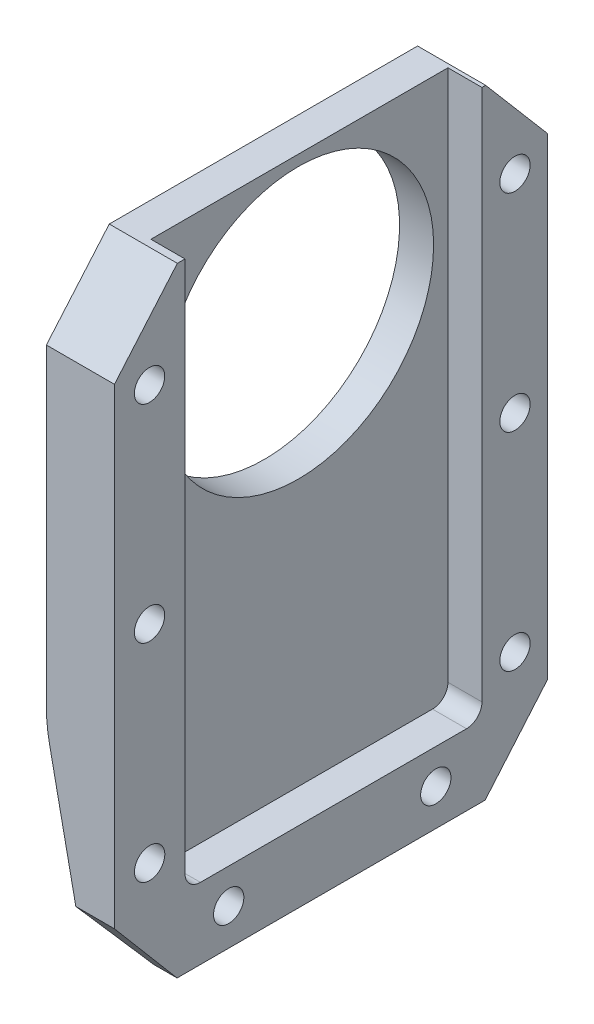
ISO-10303-21;
HEADER;
FILE_DESCRIPTION(('STEP AP214'),'2;1');
FILE_NAME('part.step','',(''),(''),'','','');
FILE_SCHEMA(('AUTOMOTIVE_DESIGN { 1 0 10303 214 1 1 1 1 }'));
ENDSEC;
DATA;
#1=APPLICATION_CONTEXT('core data for automotive mechanical design processes');
#2=APPLICATION_PROTOCOL_DEFINITION('international standard','automotive_design',2000,#1);
#3=PRODUCT_CONTEXT('',#1,'mechanical');
#4=PRODUCT('Part','Part','',(#3));
#5=PRODUCT_RELATED_PRODUCT_CATEGORY('part','',(#4));
#6=PRODUCT_DEFINITION_FORMATION('','',#4);
#7=PRODUCT_DEFINITION_CONTEXT('part definition',#1,'design');
#8=PRODUCT_DEFINITION('design','',#6,#7);
#9=PRODUCT_DEFINITION_SHAPE('','',#8);
#10=(LENGTH_UNIT() NAMED_UNIT(*) SI_UNIT(.MILLI.,.METRE.));
#11=(NAMED_UNIT(*) PLANE_ANGLE_UNIT() SI_UNIT($,.RADIAN.));
#12=(NAMED_UNIT(*) SI_UNIT($,.STERADIAN.) SOLID_ANGLE_UNIT());
#13=UNCERTAINTY_MEASURE_WITH_UNIT(LENGTH_MEASURE(1.E-05),#10,'distance_accuracy_value','');
#14=(GEOMETRIC_REPRESENTATION_CONTEXT(3) GLOBAL_UNCERTAINTY_ASSIGNED_CONTEXT((#13)) GLOBAL_UNIT_ASSIGNED_CONTEXT((#10,
#11,#12)) REPRESENTATION_CONTEXT('',''));
#15=CARTESIAN_POINT('',(0.,0.,0.));
#16=DIRECTION('',(0.,0.,1.));
#17=DIRECTION('',(1.,0.,0.));
#18=AXIS2_PLACEMENT_3D('',#15,#16,#17);
#19=CARTESIAN_POINT('',(-1.91664376205864,0.,35.56));
#20=DIRECTION('',(0.,1.,0.));
#21=DIRECTION('',(0.,0.,1.));
#22=AXIS2_PLACEMENT_3D('',#19,#20,#21);
#23=PLANE('',#22);
#24=DIRECTION('',(0.,0.,-1.));
#25=VECTOR('',#24,1.);
#26=CARTESIAN_POINT('',(-1.91664376205864,0.,35.56));
#27=LINE('',#26,#25);
#28=CARTESIAN_POINT('',(-1.91664376205864,0.,30.4170918583045));
#29=VERTEX_POINT('',#28);
#30=CARTESIAN_POINT('',(-1.91664376205864,0.,5.12869281639009));
#31=VERTEX_POINT('',#30);
#32=EDGE_CURVE('E189',#29,#31,#27,.T.);
#33=ORIENTED_EDGE('',*,*,#32,.T.);
#34=DIRECTION('',(1.,0.,0.));
#35=VECTOR('',#34,1.);
#36=CARTESIAN_POINT('',(-5.588,0.,5.12869281639009));
#37=LINE('',#36,#35);
#38=CARTESIAN_POINT('',(0.,0.,5.12869281639009));
#39=VERTEX_POINT('',#38);
#40=EDGE_CURVE('E248',#31,#39,#37,.T.);
#41=ORIENTED_EDGE('',*,*,#40,.T.);
#42=DIRECTION('',(0.,0.,-1.));
#43=VECTOR('',#42,1.);
#44=CARTESIAN_POINT('',(0.,0.,35.56));
#45=LINE('',#44,#43);
#46=CARTESIAN_POINT('',(0.,0.,30.4170918583045));
#47=VERTEX_POINT('',#46);
#48=EDGE_CURVE('E197',#47,#39,#45,.T.);
#49=ORIENTED_EDGE('',*,*,#48,.F.);
#50=DIRECTION('',(1.,0.,0.));
#51=VECTOR('',#50,1.);
#52=CARTESIAN_POINT('',(-5.588,0.,30.4170918583045));
#53=LINE('',#52,#51);
#54=EDGE_CURVE('E229',#29,#47,#53,.T.);
#55=ORIENTED_EDGE('',*,*,#54,.F.);
#56=EDGE_LOOP('',(#33,#41,#49,#55));
#57=FACE_BOUND('',#56,.T.);
#58=ADVANCED_FACE('F43',(#57),#23,.F.);
#59=CARTESIAN_POINT('',(0.,0.,35.56));
#60=DIRECTION('',(-1.,0.,0.));
#61=DIRECTION('',(0.,0.,1.));
#62=AXIS2_PLACEMENT_3D('',#59,#60,#61);
#63=PLANE('',#62);
#64=CARTESIAN_POINT('',(0.,43.3095233691544,2.67853591924794));
#65=DIRECTION('',(-1.,0.,0.));
#66=DIRECTION('',(0.,0.,1.));
#67=AXIS2_PLACEMENT_3D('',#64,#65,#66);
#68=CIRCLE('',#67,1.24459999999998);
#69=CARTESIAN_POINT('',(0.,43.3095233691544,3.92313591924793));
#70=VERTEX_POINT('',#69);
#71=EDGE_CURVE('E568',#70,#70,#68,.T.);
#72=ORIENTED_EDGE('',*,*,#71,.T.);
#73=EDGE_LOOP('',(#72));
#74=FACE_BOUND('',#73,.T.);
#75=CARTESIAN_POINT('',(0.,26.3095233691544,2.67853591924794));
#76=DIRECTION('',(-1.,0.,0.));
#77=DIRECTION('',(0.,0.,1.));
#78=AXIS2_PLACEMENT_3D('',#75,#76,#77);
#79=CIRCLE('',#78,1.24459999999999);
#80=CARTESIAN_POINT('',(0.,26.3095233691544,3.92313591924793));
#81=VERTEX_POINT('',#80);
#82=EDGE_CURVE('E579',#81,#81,#79,.T.);
#83=ORIENTED_EDGE('',*,*,#82,.T.);
#84=EDGE_LOOP('',(#83));
#85=FACE_BOUND('',#84,.T.);
#86=CARTESIAN_POINT('',(0.,9.30952336915439,2.67853591924794));
#87=DIRECTION('',(-1.,0.,0.));
#88=DIRECTION('',(0.,0.,1.));
#89=AXIS2_PLACEMENT_3D('',#86,#87,#88);
#90=CIRCLE('',#89,1.24459999999999);
#91=CARTESIAN_POINT('',(0.,9.30952336915439,3.92313591924793));
#92=VERTEX_POINT('',#91);
#93=EDGE_CURVE('E582',#92,#92,#90,.T.);
#94=ORIENTED_EDGE('',*,*,#93,.T.);
#95=EDGE_LOOP('',(#94));
#96=FACE_BOUND('',#95,.T.);
#97=CARTESIAN_POINT('',(0.,3.00952336915439,9.17853591924794));
#98=DIRECTION('',(-1.,0.,0.));
#99=DIRECTION('',(0.,0.,1.));
#100=AXIS2_PLACEMENT_3D('',#97,#98,#99);
#101=CIRCLE('',#100,1.24459999999999);
#102=CARTESIAN_POINT('',(0.,3.00952336915439,10.4231359192479));
#103=VERTEX_POINT('',#102);
#104=EDGE_CURVE('E588',#103,#103,#101,.T.);
#105=ORIENTED_EDGE('',*,*,#104,.T.);
#106=EDGE_LOOP('',(#105));
#107=FACE_BOUND('',#106,.T.);
#108=CARTESIAN_POINT('',(0.,2.9991799424324,26.181895158461));
#109=DIRECTION('',(-1.,0.,0.));
#110=DIRECTION('',(0.,0.,1.));
#111=AXIS2_PLACEMENT_3D('',#108,#109,#110);
#112=CIRCLE('',#111,1.24459999999999);
#113=CARTESIAN_POINT('',(0.,2.9991799424324,27.4264951584609));
#114=VERTEX_POINT('',#113);
#115=EDGE_CURVE('E594',#114,#114,#112,.T.);
#116=ORIENTED_EDGE('',*,*,#115,.T.);
#117=EDGE_LOOP('',(#116));
#118=FACE_BOUND('',#117,.T.);
#119=CARTESIAN_POINT('',(0.,9.2991799424324,32.6729429087411));
#120=DIRECTION('',(-1.,0.,0.));
#121=DIRECTION('',(0.,0.,1.));
#122=AXIS2_PLACEMENT_3D('',#119,#120,#121);
#123=CIRCLE('',#122,1.24459999999999);
#124=CARTESIAN_POINT('',(0.,9.2991799424324,33.9175429087411));
#125=VERTEX_POINT('',#124);
#126=EDGE_CURVE('E600',#125,#125,#123,.T.);
#127=ORIENTED_EDGE('',*,*,#126,.T.);
#128=EDGE_LOOP('',(#127));
#129=FACE_BOUND('',#128,.T.);
#130=CARTESIAN_POINT('',(0.,26.3095233691544,32.6785359192479));
#131=DIRECTION('',(-1.,0.,0.));
#132=DIRECTION('',(0.,0.,1.));
#133=AXIS2_PLACEMENT_3D('',#130,#131,#132);
#134=CIRCLE('',#133,1.24459999999999);
#135=CARTESIAN_POINT('',(0.,26.3095233691544,33.9231359192479));
#136=VERTEX_POINT('',#135);
#137=EDGE_CURVE('E609',#136,#136,#134,.T.);
#138=ORIENTED_EDGE('',*,*,#137,.T.);
#139=EDGE_LOOP('',(#138));
#140=FACE_BOUND('',#139,.T.);
#141=CARTESIAN_POINT('',(0.,43.2991799424324,32.6785359192479));
#142=DIRECTION('',(-1.,0.,0.));
#143=DIRECTION('',(0.,0.,1.));
#144=AXIS2_PLACEMENT_3D('',#141,#142,#143);
#145=CIRCLE('',#144,1.24459999999998);
#146=CARTESIAN_POINT('',(0.,43.2991799424324,33.9231359192479));
#147=VERTEX_POINT('',#146);
#148=EDGE_CURVE('E235',#147,#147,#145,.T.);
#149=ORIENTED_EDGE('',*,*,#148,.T.);
#150=EDGE_LOOP('',(#149));
#151=FACE_BOUND('',#150,.T.);
#152=DIRECTION('',(0.,1.,0.));
#153=VECTOR('',#152,1.);
#154=CARTESIAN_POINT('',(0.,0.,0.));
#155=LINE('',#154,#153);
#156=CARTESIAN_POINT('',(0.,6.02953117205409,0.));
#157=VERTEX_POINT('',#156);
#158=CARTESIAN_POINT('',(0.,44.8248953626975,0.));
#159=VERTEX_POINT('',#158);
#160=EDGE_CURVE('E180',#157,#159,#155,.T.);
#161=ORIENTED_EDGE('',*,*,#160,.T.);
#162=DIRECTION('',(0.,-0.761517392748183,-0.648144475053216));
#163=VECTOR('',#162,1.);
#164=CARTESIAN_POINT('',(0.,44.8248953626975,0.));
#165=LINE('',#164,#163);
#166=CARTESIAN_POINT('',(0.,50.8,5.08554511743511));
#167=VERTEX_POINT('',#166);
#168=EDGE_CURVE('E67',#167,#159,#165,.T.);
#169=ORIENTED_EDGE('',*,*,#168,.F.);
#170=DIRECTION('',(0.,0.,-1.));
#171=VECTOR('',#170,1.);
#172=CARTESIAN_POINT('',(0.,50.8,35.56));
#173=LINE('',#172,#171);
#174=CARTESIAN_POINT('',(0.,50.8,5.38804272725211));
#175=VERTEX_POINT('',#174);
#176=EDGE_CURVE('E194',#175,#167,#173,.T.);
#177=ORIENTED_EDGE('',*,*,#176,.F.);
#178=DIRECTION('',(0.,1.,0.));
#179=VECTOR('',#178,1.);
#180=CARTESIAN_POINT('',(0.,50.8,5.38804272725211));
#181=LINE('',#180,#179);
#182=CARTESIAN_POINT('',(0.,7.11199999999999,5.3880427272521));
#183=VERTEX_POINT('',#182);
#184=EDGE_CURVE('E273',#183,#175,#181,.T.);
#185=ORIENTED_EDGE('',*,*,#184,.F.);
#186=CARTESIAN_POINT('',(0.,7.11199999999999,6.6580427272521));
#187=DIRECTION('',(-1.,0.,0.));
#188=DIRECTION('',(0.,0.,1.));
#189=AXIS2_PLACEMENT_3D('',#186,#187,#188);
#190=CIRCLE('',#189,1.27);
#191=CARTESIAN_POINT('',(0.,5.84199999999999,6.6580427272521));
#192=VERTEX_POINT('',#191);
#193=EDGE_CURVE('E224',#183,#192,#190,.T.);
#194=ORIENTED_EDGE('',*,*,#193,.T.);
#195=DIRECTION('',(0.,0.,-1.));
#196=VECTOR('',#195,1.);
#197=CARTESIAN_POINT('',(0.,5.84199999999999,29.7720427272521));
#198=LINE('',#197,#196);
#199=CARTESIAN_POINT('',(0.,5.84199999999999,28.5020427272521));
#200=VERTEX_POINT('',#199);
#201=EDGE_CURVE('E284',#200,#192,#198,.T.);
#202=ORIENTED_EDGE('',*,*,#201,.F.);
#203=CARTESIAN_POINT('',(0.,7.11199999999999,28.5020427272521));
#204=DIRECTION('',(-1.,0.,0.));
#205=DIRECTION('',(0.,0.,1.));
#206=AXIS2_PLACEMENT_3D('',#203,#204,#205);
#207=CIRCLE('',#206,1.27);
#208=CARTESIAN_POINT('',(0.,7.11199999999999,29.7720427272521));
#209=VERTEX_POINT('',#208);
#210=EDGE_CURVE('E222',#200,#209,#207,.T.);
#211=ORIENTED_EDGE('',*,*,#210,.T.);
#212=DIRECTION('',(0.,-1.,0.));
#213=VECTOR('',#212,1.);
#214=CARTESIAN_POINT('',(0.,50.8,29.7720427272521));
#215=LINE('',#214,#213);
#216=CARTESIAN_POINT('',(0.,50.8,29.7720427272521));
#217=VERTEX_POINT('',#216);
#218=EDGE_CURVE('E266',#217,#209,#215,.T.);
#219=ORIENTED_EDGE('',*,*,#218,.F.);
#220=CARTESIAN_POINT('',(0.,50.8,30.3975808510955));
#221=VERTEX_POINT('',#220);
#222=EDGE_CURVE('E195',#221,#217,#173,.T.);
#223=ORIENTED_EDGE('',*,*,#222,.F.);
#224=DIRECTION('',(0.,0.759083371781677,-0.650993421383473));
#225=VECTOR('',#224,1.);
#226=CARTESIAN_POINT('',(0.,44.780420684171,35.56));
#227=LINE('',#226,#225);
#228=CARTESIAN_POINT('',(0.,44.780420684171,35.56));
#229=VERTEX_POINT('',#228);
#230=EDGE_CURVE('E258',#229,#221,#227,.T.);
#231=ORIENTED_EDGE('',*,*,#230,.F.);
#232=DIRECTION('',(0.,1.,0.));
#233=VECTOR('',#232,1.);
#234=CARTESIAN_POINT('',(0.,0.,35.56));
#235=LINE('',#234,#233);
#236=CARTESIAN_POINT('',(0.,6.07121687996455,35.56));
#237=VERTEX_POINT('',#236);
#238=EDGE_CURVE('E183',#237,#229,#235,.T.);
#239=ORIENTED_EDGE('',*,*,#238,.F.);
#240=DIRECTION('',(0.,0.763031396083279,0.646361422573472));
#241=VECTOR('',#240,1.);
#242=CARTESIAN_POINT('',(0.,0.,30.4170918583045));
#243=LINE('',#242,#241);
#244=EDGE_CURVE('E59',#47,#237,#243,.T.);
#245=ORIENTED_EDGE('',*,*,#244,.F.);
#246=ORIENTED_EDGE('',*,*,#48,.T.);
#247=DIRECTION('',(0.,-0.761715388262673,0.647911774305611));
#248=VECTOR('',#247,1.);
#249=CARTESIAN_POINT('',(0.,6.02953117205409,0.));
#250=LINE('',#249,#248);
#251=EDGE_CURVE('E245',#157,#39,#250,.T.);
#252=ORIENTED_EDGE('',*,*,#251,.F.);
#253=EDGE_LOOP('',(#161,#169,#177,#185,#194,#202,#211,#219,#223,#231,#239,#245,#246,#252));
#254=FACE_BOUND('',#253,.T.);
#255=ADVANCED_FACE('F313',(#74,#85,#96,#107,#118,#129,#140,#151,#254),#63,.F.);
#256=CARTESIAN_POINT('',(0.,50.8,35.56));
#257=DIRECTION('',(0.,-1.,0.));
#258=DIRECTION('',(0.,0.,-1.));
#259=AXIS2_PLACEMENT_3D('',#256,#257,#258);
#260=PLANE('',#259);
#261=ORIENTED_EDGE('',*,*,#176,.T.);
#262=DIRECTION('',(1.,0.,0.));
#263=VECTOR('',#262,1.);
#264=CARTESIAN_POINT('',(-5.588,50.8,5.08554511743511));
#265=LINE('',#264,#263);
#266=CARTESIAN_POINT('',(-5.588,50.8,5.08554511743511));
#267=VERTEX_POINT('',#266);
#268=EDGE_CURVE('E163',#267,#167,#265,.T.);
#269=ORIENTED_EDGE('',*,*,#268,.F.);
#270=DIRECTION('',(0.,0.,-1.));
#271=VECTOR('',#270,1.);
#272=CARTESIAN_POINT('',(-5.588,50.8,35.56));
#273=LINE('',#272,#271);
#274=CARTESIAN_POINT('',(-5.588,50.8,30.3975808510955));
#275=VERTEX_POINT('',#274);
#276=EDGE_CURVE('E173',#275,#267,#273,.T.);
#277=ORIENTED_EDGE('',*,*,#276,.F.);
#278=DIRECTION('',(1.,0.,0.));
#279=VECTOR('',#278,1.);
#280=CARTESIAN_POINT('',(-5.588,50.8,30.3975808510955));
#281=LINE('',#280,#279);
#282=EDGE_CURVE('E263',#275,#221,#281,.T.);
#283=ORIENTED_EDGE('',*,*,#282,.T.);
#284=ORIENTED_EDGE('',*,*,#222,.T.);
#285=DIRECTION('',(1.,0.,0.));
#286=VECTOR('',#285,1.);
#287=CARTESIAN_POINT('',(-2.794,50.8,29.7720427272521));
#288=LINE('',#287,#286);
#289=CARTESIAN_POINT('',(-2.794,50.8,29.7720427272521));
#290=VERTEX_POINT('',#289);
#291=EDGE_CURVE('E185',#290,#217,#288,.T.);
#292=ORIENTED_EDGE('',*,*,#291,.F.);
#293=DIRECTION('',(0.,0.,1.));
#294=VECTOR('',#293,1.);
#295=CARTESIAN_POINT('',(-2.794,50.8,29.7720427272521));
#296=LINE('',#295,#294);
#297=CARTESIAN_POINT('',(-2.794,50.8,5.3880427272521));
#298=VERTEX_POINT('',#297);
#299=EDGE_CURVE('E278',#298,#290,#296,.T.);
#300=ORIENTED_EDGE('',*,*,#299,.F.);
#301=DIRECTION('',(1.,0.,0.));
#302=VECTOR('',#301,1.);
#303=CARTESIAN_POINT('',(-2.794,50.8,5.38804272725211));
#304=LINE('',#303,#302);
#305=EDGE_CURVE('E281',#298,#175,#304,.T.);
#306=ORIENTED_EDGE('',*,*,#305,.T.);
#307=EDGE_LOOP('',(#261,#269,#277,#283,#284,#292,#300,#306));
#308=FACE_BOUND('',#307,.T.);
#309=ADVANCED_FACE('F318',(#308),#260,.F.);
#310=CARTESIAN_POINT('',(-5.588,50.8,35.56));
#311=DIRECTION('',(1.,0.,0.));
#312=DIRECTION('',(0.,0.,-1.));
#313=AXIS2_PLACEMENT_3D('',#310,#311,#312);
#314=PLANE('',#313);
#315=CARTESIAN_POINT('',(-5.588,43.3095233691544,2.67853591924794));
#316=DIRECTION('',(-1.,0.,0.));
#317=DIRECTION('',(0.,0.,1.));
#318=AXIS2_PLACEMENT_3D('',#315,#316,#317);
#319=CIRCLE('',#318,1.8796);
#320=CARTESIAN_POINT('',(-5.588,43.3095233691544,4.55813591924795));
#321=VERTEX_POINT('',#320);
#322=EDGE_CURVE('E566',#321,#321,#319,.T.);
#323=ORIENTED_EDGE('',*,*,#322,.F.);
#324=EDGE_LOOP('',(#323));
#325=FACE_BOUND('',#324,.T.);
#326=CARTESIAN_POINT('',(-5.588,26.3095233691544,2.67853591924794));
#327=DIRECTION('',(-1.,0.,0.));
#328=DIRECTION('',(0.,0.,1.));
#329=AXIS2_PLACEMENT_3D('',#326,#327,#328);
#330=CIRCLE('',#329,1.8796);
#331=CARTESIAN_POINT('',(-5.588,26.3095233691544,4.55813591924794));
#332=VERTEX_POINT('',#331);
#333=EDGE_CURVE('E573',#332,#332,#330,.T.);
#334=ORIENTED_EDGE('',*,*,#333,.F.);
#335=EDGE_LOOP('',(#334));
#336=FACE_BOUND('',#335,.T.);
#337=CARTESIAN_POINT('',(-5.588,26.3095233691544,32.6785359192479));
#338=DIRECTION('',(-1.,0.,0.));
#339=DIRECTION('',(0.,0.,1.));
#340=AXIS2_PLACEMENT_3D('',#337,#338,#339);
#341=CIRCLE('',#340,1.8796);
#342=CARTESIAN_POINT('',(-5.588,26.3095233691544,34.5581359192479));
#343=VERTEX_POINT('',#342);
#344=EDGE_CURVE('E603',#343,#343,#341,.T.);
#345=ORIENTED_EDGE('',*,*,#344,.F.);
#346=EDGE_LOOP('',(#345));
#347=FACE_BOUND('',#346,.T.);
#348=CARTESIAN_POINT('',(-5.588,43.2991799424324,32.6785359192479));
#349=DIRECTION('',(-1.,0.,0.));
#350=DIRECTION('',(0.,0.,1.));
#351=AXIS2_PLACEMENT_3D('',#348,#349,#350);
#352=CIRCLE('',#351,1.8796);
#353=CARTESIAN_POINT('',(-5.588,43.2991799424324,34.558135919248));
#354=VERTEX_POINT('',#353);
#355=EDGE_CURVE('E612',#354,#354,#352,.T.);
#356=ORIENTED_EDGE('',*,*,#355,.F.);
#357=EDGE_LOOP('',(#356));
#358=FACE_BOUND('',#357,.T.);
#359=CARTESIAN_POINT('',(-5.588,38.8095233691544,17.6785359192479));
#360=DIRECTION('',(-1.,0.,0.));
#361=DIRECTION('',(0.,0.,1.));
#362=AXIS2_PLACEMENT_3D('',#359,#360,#361);
#363=CIRCLE('',#362,11.1125);
#364=CARTESIAN_POINT('',(-5.588,38.8095233691544,28.7910359192479));
#365=VERTEX_POINT('',#364);
#366=EDGE_CURVE('E230',#365,#365,#363,.T.);
#367=ORIENTED_EDGE('',*,*,#366,.F.);
#368=EDGE_LOOP('',(#367));
#369=FACE_BOUND('',#368,.T.);
#370=ORIENTED_EDGE('',*,*,#276,.T.);
#371=DIRECTION('',(0.,-0.761517392748183,-0.648144475053216));
#372=VECTOR('',#371,1.);
#373=CARTESIAN_POINT('',(-5.588,44.8248953626975,0.));
#374=LINE('',#373,#372);
#375=CARTESIAN_POINT('',(-5.588,44.8248953626975,0.));
#376=VERTEX_POINT('',#375);
#377=EDGE_CURVE('E157',#267,#376,#374,.T.);
#378=ORIENTED_EDGE('',*,*,#377,.T.);
#379=DIRECTION('',(0.,-1.,0.));
#380=VECTOR('',#379,1.);
#381=CARTESIAN_POINT('',(-5.588,50.8,0.));
#382=LINE('',#381,#380);
#383=CARTESIAN_POINT('',(-5.588,19.0775124180395,0.));
#384=VERTEX_POINT('',#383);
#385=EDGE_CURVE('E169',#376,#384,#382,.T.);
#386=ORIENTED_EDGE('',*,*,#385,.T.);
#387=DIRECTION('',(0.,0.,-1.));
#388=VECTOR('',#387,1.);
#389=CARTESIAN_POINT('',(-5.588,19.0775124180395,35.56));
#390=LINE('',#389,#388);
#391=CARTESIAN_POINT('',(-5.588,19.0775124180395,35.56));
#392=VERTEX_POINT('',#391);
#393=EDGE_CURVE('E204',#384,#392,#390,.F.);
#394=ORIENTED_EDGE('',*,*,#393,.T.);
#395=DIRECTION('',(0.,-1.,0.));
#396=VECTOR('',#395,1.);
#397=CARTESIAN_POINT('',(-5.588,50.8,35.56));
#398=LINE('',#397,#396);
#399=CARTESIAN_POINT('',(-5.588,44.780420684171,35.56));
#400=VERTEX_POINT('',#399);
#401=EDGE_CURVE('E293',#400,#392,#398,.T.);
#402=ORIENTED_EDGE('',*,*,#401,.F.);
#403=DIRECTION('',(0.,0.759083371781677,-0.650993421383473));
#404=VECTOR('',#403,1.);
#405=CARTESIAN_POINT('',(-5.588,44.780420684171,35.56));
#406=LINE('',#405,#404);
#407=EDGE_CURVE('E259',#400,#275,#406,.T.);
#408=ORIENTED_EDGE('',*,*,#407,.T.);
#409=EDGE_LOOP('',(#370,#378,#386,#394,#402,#408));
#410=FACE_BOUND('',#409,.T.);
#411=ADVANCED_FACE('F167',(#325,#336,#347,#358,#369,#410),#314,.F.);
#412=CARTESIAN_POINT('',(-5.588,17.78,35.56));
#413=DIRECTION('',(0.979339732195538,0.20222188047581,0.));
#414=DIRECTION('',(-0.20222188047581,0.979339732195538,0.));
#415=AXIS2_PLACEMENT_3D('',#412,#413,#414);
#416=PLANE('',#415);
#417=CARTESIAN_POINT('',(-3.8389484129926,9.30952336915439,2.67853591924794));
#418=DIRECTION('',(0.979339732195538,0.20222188047581,0.));
#419=DIRECTION('',(-0.20222188047581,0.979339732195538,0.));
#420=AXIS2_PLACEMENT_3D('',#417,#418,#419);
#421=ELLIPSE('',#420,1.27085623005387,1.24459999999999);
#422=CARTESIAN_POINT('',(-4.0959433496485,10.5541233691544,2.67853591924794));
#423=VERTEX_POINT('',#422);
#424=EDGE_CURVE('E585',#423,#423,#421,.T.);
#425=ORIENTED_EDGE('',*,*,#424,.T.);
#426=EDGE_LOOP('',(#425));
#427=FACE_BOUND('',#426,.T.);
#428=CARTESIAN_POINT('',(-2.53807415545433,3.00952336915439,9.17853591924794));
#429=DIRECTION('',(0.979339732195538,0.20222188047581,0.));
#430=DIRECTION('',(-0.20222188047581,0.979339732195538,0.));
#431=AXIS2_PLACEMENT_3D('',#428,#429,#430);
#432=ELLIPSE('',#431,1.27085623005388,1.24459999999999);
#433=CARTESIAN_POINT('',(-2.79506909211022,4.25412336915439,9.17853591924794));
#434=VERTEX_POINT('',#433);
#435=EDGE_CURVE('E591',#434,#434,#432,.T.);
#436=ORIENTED_EDGE('',*,*,#435,.T.);
#437=EDGE_LOOP('',(#436));
#438=FACE_BOUND('',#437,.T.);
#439=CARTESIAN_POINT('',(-2.53593836219125,2.9991799424324,26.181895158461));
#440=DIRECTION('',(0.979339732195538,0.20222188047581,0.));
#441=DIRECTION('',(-0.20222188047581,0.979339732195538,0.));
#442=AXIS2_PLACEMENT_3D('',#439,#440,#441);
#443=ELLIPSE('',#442,1.27085623005388,1.24459999999999);
#444=CARTESIAN_POINT('',(-2.79293329884715,4.24377994243239,26.181895158461));
#445=VERTEX_POINT('',#444);
#446=EDGE_CURVE('E597',#445,#445,#443,.T.);
#447=ORIENTED_EDGE('',*,*,#446,.T.);
#448=EDGE_LOOP('',(#447));
#449=FACE_BOUND('',#448,.T.);
#450=CARTESIAN_POINT('',(-3.83681261972953,9.2991799424324,32.6729429087411));
#451=DIRECTION('',(0.979339732195538,0.20222188047581,0.));
#452=DIRECTION('',(-0.20222188047581,0.979339732195538,0.));
#453=AXIS2_PLACEMENT_3D('',#450,#451,#452);
#454=ELLIPSE('',#453,1.27085623005387,1.24459999999999);
#455=CARTESIAN_POINT('',(-4.09380755638542,10.5437799424324,32.6729429087411));
#456=VERTEX_POINT('',#455);
#457=EDGE_CURVE('E47',#456,#456,#454,.T.);
#458=ORIENTED_EDGE('',*,*,#457,.T.);
#459=EDGE_LOOP('',(#458));
#460=FACE_BOUND('',#459,.T.);
#461=DIRECTION('',(0.20222188047581,-0.979339732195537,0.));
#462=VECTOR('',#461,1.);
#463=CARTESIAN_POINT('',(-5.588,17.78,0.));
#464=LINE('',#463,#462);
#465=CARTESIAN_POINT('',(-5.32561459888333,16.5092945359968,0.));
#466=VERTEX_POINT('',#465);
#467=CARTESIAN_POINT('',(-3.16166945836813,6.02953117205409,0.));
#468=VERTEX_POINT('',#467);
#469=EDGE_CURVE('E179',#466,#468,#464,.T.);
#470=ORIENTED_EDGE('',*,*,#469,.T.);
#471=DIRECTION('',(0.155374932595926,-0.752464790260893,0.640043256146366));
#472=VECTOR('',#471,1.);
#473=CARTESIAN_POINT('',(-1.05771680292443,-4.15969476772149,8.666910973793));
#474=LINE('',#473,#472);
#475=EDGE_CURVE('E246',#468,#31,#474,.T.);
#476=ORIENTED_EDGE('',*,*,#475,.T.);
#477=ORIENTED_EDGE('',*,*,#32,.F.);
#478=DIRECTION('',(-0.155636875365988,0.753733352108303,0.638485079658008));
#479=VECTOR('',#478,1.);
#480=CARTESIAN_POINT('',(-4.60238333527081,13.0067600409402,41.4350761329861));
#481=LINE('',#480,#479);
#482=CARTESIAN_POINT('',(-3.1702770558805,6.07121687996455,35.56));
#483=VERTEX_POINT('',#482);
#484=EDGE_CURVE('E255',#29,#483,#481,.T.);
#485=ORIENTED_EDGE('',*,*,#484,.T.);
#486=DIRECTION('',(0.20222188047581,-0.979339732195537,0.));
#487=VECTOR('',#486,1.);
#488=CARTESIAN_POINT('',(-5.588,17.78,35.56));
#489=LINE('',#488,#487);
#490=CARTESIAN_POINT('',(-5.32561459888333,16.5092945359968,35.56));
#491=VERTEX_POINT('',#490);
#492=EDGE_CURVE('E192',#491,#483,#489,.T.);
#493=ORIENTED_EDGE('',*,*,#492,.F.);
#494=DIRECTION('',(0.,0.,-1.));
#495=VECTOR('',#494,1.);
#496=CARTESIAN_POINT('',(-5.32561459888333,16.5092945359968,35.56));
#497=LINE('',#496,#495);
#498=EDGE_CURVE('E200',#491,#466,#497,.T.);
#499=ORIENTED_EDGE('',*,*,#498,.T.);
#500=EDGE_LOOP('',(#470,#476,#477,#485,#493,#499));
#501=FACE_BOUND('',#500,.T.);
#502=ADVANCED_FACE('F302',(#427,#438,#449,#460,#501),#416,.F.);
#503=CARTESIAN_POINT('',(0.,0.,35.56));
#504=DIRECTION('',(0.,0.,1.));
#505=DIRECTION('',(1.,0.,0.));
#506=AXIS2_PLACEMENT_3D('',#503,#504,#505);
#507=PLANE('',#506);
#508=DIRECTION('',(-1.,0.,0.));
#509=VECTOR('',#508,1.);
#510=CARTESIAN_POINT('',(0.,6.07121687996455,35.56));
#511=LINE('',#510,#509);
#512=EDGE_CURVE('E11',#237,#483,#511,.T.);
#513=ORIENTED_EDGE('',*,*,#512,.F.);
#514=ORIENTED_EDGE('',*,*,#238,.T.);
#515=DIRECTION('',(1.,0.,0.));
#516=VECTOR('',#515,1.);
#517=CARTESIAN_POINT('',(-5.588,44.780420684171,35.56));
#518=LINE('',#517,#516);
#519=EDGE_CURVE('E261',#400,#229,#518,.T.);
#520=ORIENTED_EDGE('',*,*,#519,.F.);
#521=ORIENTED_EDGE('',*,*,#401,.T.);
#522=CARTESIAN_POINT('',(7.112,19.0775124180395,35.56));
#523=DIRECTION('',(0.,0.,1.));
#524=DIRECTION('',(1.,0.,0.));
#525=AXIS2_PLACEMENT_3D('',#522,#523,#524);
#526=CIRCLE('',#525,12.7);
#527=EDGE_CURVE('E206',#392,#491,#526,.T.);
#528=ORIENTED_EDGE('',*,*,#527,.T.);
#529=ORIENTED_EDGE('',*,*,#492,.T.);
#530=EDGE_LOOP('',(#513,#514,#520,#521,#528,#529));
#531=FACE_BOUND('',#530,.T.);
#532=ADVANCED_FACE('F297',(#531),#507,.T.);
#533=CARTESIAN_POINT('',(0.,0.,0.));
#534=DIRECTION('',(0.,0.,1.));
#535=DIRECTION('',(1.,0.,0.));
#536=AXIS2_PLACEMENT_3D('',#533,#534,#535);
#537=PLANE('',#536);
#538=ORIENTED_EDGE('',*,*,#385,.F.);
#539=DIRECTION('',(1.,0.,0.));
#540=VECTOR('',#539,1.);
#541=CARTESIAN_POINT('',(-5.588,44.8248953626975,0.));
#542=LINE('',#541,#540);
#543=EDGE_CURVE('E154',#376,#159,#542,.T.);
#544=ORIENTED_EDGE('',*,*,#543,.T.);
#545=ORIENTED_EDGE('',*,*,#160,.F.);
#546=DIRECTION('',(-1.,0.,0.));
#547=VECTOR('',#546,1.);
#548=CARTESIAN_POINT('',(0.,6.02953117205409,0.));
#549=LINE('',#548,#547);
#550=EDGE_CURVE('E52',#157,#468,#549,.T.);
#551=ORIENTED_EDGE('',*,*,#550,.T.);
#552=ORIENTED_EDGE('',*,*,#469,.F.);
#553=CARTESIAN_POINT('',(7.112,19.0775124180395,0.));
#554=DIRECTION('',(0.,0.,1.));
#555=DIRECTION('',(1.,0.,0.));
#556=AXIS2_PLACEMENT_3D('',#553,#554,#555);
#557=CIRCLE('',#556,12.7);
#558=EDGE_CURVE('E177',#466,#384,#557,.F.);
#559=ORIENTED_EDGE('',*,*,#558,.T.);
#560=EDGE_LOOP('',(#538,#544,#545,#551,#552,#559));
#561=FACE_BOUND('',#560,.T.);
#562=ADVANCED_FACE('F175',(#561),#537,.F.);
#563=CARTESIAN_POINT('',(7.112,19.0775124180395,35.56));
#564=DIRECTION('',(0.,0.,-1.));
#565=DIRECTION('',(-1.,0.,0.));
#566=AXIS2_PLACEMENT_3D('',#563,#564,#565);
#567=CYLINDRICAL_SURFACE('',#566,12.7);
#568=ORIENTED_EDGE('',*,*,#527,.F.);
#569=ORIENTED_EDGE('',*,*,#393,.F.);
#570=ORIENTED_EDGE('',*,*,#558,.F.);
#571=ORIENTED_EDGE('',*,*,#498,.F.);
#572=EDGE_LOOP('',(#568,#569,#570,#571));
#573=FACE_BOUND('',#572,.T.);
#574=ADVANCED_FACE('F305',(#573),#567,.T.);
#575=CARTESIAN_POINT('',(-2.794,50.8,29.7720427272521));
#576=DIRECTION('',(0.,0.,1.));
#577=DIRECTION('',(0.,-1.,0.));
#578=AXIS2_PLACEMENT_3D('',#575,#576,#577);
#579=PLANE('',#578);
#580=ORIENTED_EDGE('',*,*,#218,.T.);
#581=DIRECTION('',(1.,0.,0.));
#582=VECTOR('',#581,1.);
#583=CARTESIAN_POINT('',(-2.794,7.11199999999999,29.7720427272521));
#584=LINE('',#583,#582);
#585=CARTESIAN_POINT('',(-2.794,7.11199999999999,29.7720427272521));
#586=VERTEX_POINT('',#585);
#587=EDGE_CURVE('E213',#209,#586,#584,.F.);
#588=ORIENTED_EDGE('',*,*,#587,.T.);
#589=DIRECTION('',(0.,-1.,0.));
#590=VECTOR('',#589,1.);
#591=CARTESIAN_POINT('',(-2.794,50.8,29.7720427272521));
#592=LINE('',#591,#590);
#593=EDGE_CURVE('E269',#290,#586,#592,.T.);
#594=ORIENTED_EDGE('',*,*,#593,.F.);
#595=ORIENTED_EDGE('',*,*,#291,.T.);
#596=EDGE_LOOP('',(#580,#588,#594,#595));
#597=FACE_BOUND('',#596,.T.);
#598=ADVANCED_FACE('F321',(#597),#579,.F.);
#599=CARTESIAN_POINT('',(-2.794,50.8,5.38804272725211));
#600=DIRECTION('',(0.,0.,-1.));
#601=DIRECTION('',(0.,1.,0.));
#602=AXIS2_PLACEMENT_3D('',#599,#600,#601);
#603=PLANE('',#602);
#604=DIRECTION('',(0.,1.,0.));
#605=VECTOR('',#604,1.);
#606=CARTESIAN_POINT('',(-2.794,50.8,5.38804272725211));
#607=LINE('',#606,#605);
#608=CARTESIAN_POINT('',(-2.794,7.11199999999999,5.3880427272521));
#609=VERTEX_POINT('',#608);
#610=EDGE_CURVE('E276',#609,#298,#607,.T.);
#611=ORIENTED_EDGE('',*,*,#610,.F.);
#612=DIRECTION('',(1.,0.,0.));
#613=VECTOR('',#612,1.);
#614=CARTESIAN_POINT('',(0.,7.11199999999999,5.3880427272521));
#615=LINE('',#614,#613);
#616=EDGE_CURVE('E219',#609,#183,#615,.T.);
#617=ORIENTED_EDGE('',*,*,#616,.T.);
#618=ORIENTED_EDGE('',*,*,#184,.T.);
#619=ORIENTED_EDGE('',*,*,#305,.F.);
#620=EDGE_LOOP('',(#611,#617,#618,#619));
#621=FACE_BOUND('',#620,.T.);
#622=ADVANCED_FACE('F381',(#621),#603,.F.);
#623=CARTESIAN_POINT('',(-2.794,5.84199999999999,29.7720427272521));
#624=DIRECTION('',(0.,-1.,0.));
#625=DIRECTION('',(0.,0.,-1.));
#626=AXIS2_PLACEMENT_3D('',#623,#624,#625);
#627=PLANE('',#626);
#628=DIRECTION('',(0.,0.,-1.));
#629=VECTOR('',#628,1.);
#630=CARTESIAN_POINT('',(-2.794,5.84199999999999,29.7720427272521));
#631=LINE('',#630,#629);
#632=CARTESIAN_POINT('',(-2.794,5.84199999999999,28.5020427272521));
#633=VERTEX_POINT('',#632);
#634=CARTESIAN_POINT('',(-2.794,5.84199999999999,6.6580427272521));
#635=VERTEX_POINT('',#634);
#636=EDGE_CURVE('E272',#633,#635,#631,.T.);
#637=ORIENTED_EDGE('',*,*,#636,.F.);
#638=DIRECTION('',(1.,0.,0.));
#639=VECTOR('',#638,1.);
#640=CARTESIAN_POINT('',(0.,5.84199999999999,28.5020427272521));
#641=LINE('',#640,#639);
#642=EDGE_CURVE('E210',#633,#200,#641,.T.);
#643=ORIENTED_EDGE('',*,*,#642,.T.);
#644=ORIENTED_EDGE('',*,*,#201,.T.);
#645=DIRECTION('',(1.,0.,0.));
#646=VECTOR('',#645,1.);
#647=CARTESIAN_POINT('',(-2.794,5.84199999999999,6.6580427272521));
#648=LINE('',#647,#646);
#649=EDGE_CURVE('E208',#192,#635,#648,.F.);
#650=ORIENTED_EDGE('',*,*,#649,.T.);
#651=EDGE_LOOP('',(#637,#643,#644,#650));
#652=FACE_BOUND('',#651,.T.);
#653=ADVANCED_FACE('F371',(#652),#627,.F.);
#654=CARTESIAN_POINT('',(-2.794,0.,0.));
#655=DIRECTION('',(1.,0.,0.));
#656=DIRECTION('',(0.,0.,-1.));
#657=AXIS2_PLACEMENT_3D('',#654,#655,#656);
#658=PLANE('',#657);
#659=CARTESIAN_POINT('',(-2.794,38.8095233691544,17.6785359192479));
#660=DIRECTION('',(1.,0.,0.));
#661=DIRECTION('',(0.,0.,-1.));
#662=AXIS2_PLACEMENT_3D('',#659,#660,#661);
#663=CIRCLE('',#662,11.1125);
#664=CARTESIAN_POINT('',(-2.794,38.8095233691544,6.56603591924795));
#665=VERTEX_POINT('',#664);
#666=EDGE_CURVE('E227',#665,#665,#663,.T.);
#667=ORIENTED_EDGE('',*,*,#666,.F.);
#668=EDGE_LOOP('',(#667));
#669=FACE_BOUND('',#668,.T.);
#670=ORIENTED_EDGE('',*,*,#593,.T.);
#671=CARTESIAN_POINT('',(-2.794,7.11199999999999,28.5020427272521));
#672=DIRECTION('',(1.,0.,0.));
#673=DIRECTION('',(0.,0.,-1.));
#674=AXIS2_PLACEMENT_3D('',#671,#672,#673);
#675=CIRCLE('',#674,1.27);
#676=EDGE_CURVE('E217',#586,#633,#675,.T.);
#677=ORIENTED_EDGE('',*,*,#676,.T.);
#678=ORIENTED_EDGE('',*,*,#636,.T.);
#679=CARTESIAN_POINT('',(-2.794,7.11199999999999,6.6580427272521));
#680=DIRECTION('',(1.,0.,0.));
#681=DIRECTION('',(0.,0.,-1.));
#682=AXIS2_PLACEMENT_3D('',#679,#680,#681);
#683=CIRCLE('',#682,1.27);
#684=EDGE_CURVE('E215',#635,#609,#683,.T.);
#685=ORIENTED_EDGE('',*,*,#684,.T.);
#686=ORIENTED_EDGE('',*,*,#610,.T.);
#687=ORIENTED_EDGE('',*,*,#299,.T.);
#688=EDGE_LOOP('',(#670,#677,#678,#685,#686,#687));
#689=FACE_BOUND('',#688,.T.);
#690=ADVANCED_FACE('F325',(#669,#689),#658,.T.);
#691=CARTESIAN_POINT('',(-2.794,7.11199999999999,28.5020427272521));
#692=DIRECTION('',(-1.,0.,0.));
#693=DIRECTION('',(0.,0.,1.));
#694=AXIS2_PLACEMENT_3D('',#691,#692,#693);
#695=CYLINDRICAL_SURFACE('',#694,1.27);
#696=ORIENTED_EDGE('',*,*,#676,.F.);
#697=ORIENTED_EDGE('',*,*,#587,.F.);
#698=ORIENTED_EDGE('',*,*,#210,.F.);
#699=ORIENTED_EDGE('',*,*,#642,.F.);
#700=EDGE_LOOP('',(#696,#697,#698,#699));
#701=FACE_BOUND('',#700,.T.);
#702=ADVANCED_FACE('F363',(#701),#695,.F.);
#703=CARTESIAN_POINT('',(-2.794,7.11199999999999,6.6580427272521));
#704=DIRECTION('',(-1.,0.,0.));
#705=DIRECTION('',(0.,0.,1.));
#706=AXIS2_PLACEMENT_3D('',#703,#704,#705);
#707=CYLINDRICAL_SURFACE('',#706,1.27);
#708=ORIENTED_EDGE('',*,*,#684,.F.);
#709=ORIENTED_EDGE('',*,*,#649,.F.);
#710=ORIENTED_EDGE('',*,*,#193,.F.);
#711=ORIENTED_EDGE('',*,*,#616,.F.);
#712=EDGE_LOOP('',(#708,#709,#710,#711));
#713=FACE_BOUND('',#712,.T.);
#714=ADVANCED_FACE('F45',(#713),#707,.F.);
#715=CARTESIAN_POINT('',(-5.588,44.780420684171,35.56));
#716=DIRECTION('',(0.,-0.650993421383473,-0.759083371781677));
#717=DIRECTION('',(0.,0.759083371781677,-0.650993421383473));
#718=AXIS2_PLACEMENT_3D('',#715,#716,#717);
#719=PLANE('',#718);
#720=ORIENTED_EDGE('',*,*,#230,.T.);
#721=ORIENTED_EDGE('',*,*,#282,.F.);
#722=ORIENTED_EDGE('',*,*,#407,.F.);
#723=ORIENTED_EDGE('',*,*,#519,.T.);
#724=EDGE_LOOP('',(#720,#721,#722,#723));
#725=FACE_BOUND('',#724,.T.);
#726=ADVANCED_FACE('F310',(#725),#719,.F.);
#727=CARTESIAN_POINT('',(-5.588,6.02953117205409,0.));
#728=DIRECTION('',(0.,0.647911774305611,0.761715388262673));
#729=DIRECTION('',(0.,-0.761715388262673,0.647911774305611));
#730=AXIS2_PLACEMENT_3D('',#727,#728,#729);
#731=PLANE('',#730);
#732=ORIENTED_EDGE('',*,*,#550,.F.);
#733=ORIENTED_EDGE('',*,*,#251,.T.);
#734=ORIENTED_EDGE('',*,*,#40,.F.);
#735=ORIENTED_EDGE('',*,*,#475,.F.);
#736=EDGE_LOOP('',(#732,#733,#734,#735));
#737=FACE_BOUND('',#736,.T.);
#738=ADVANCED_FACE('F347',(#737),#731,.F.);
#739=CARTESIAN_POINT('',(-5.588,44.8248953626975,0.));
#740=DIRECTION('',(0.,-0.648144475053216,0.761517392748183));
#741=DIRECTION('',(0.,-0.761517392748183,-0.648144475053216));
#742=AXIS2_PLACEMENT_3D('',#739,#740,#741);
#743=PLANE('',#742);
#744=ORIENTED_EDGE('',*,*,#168,.T.);
#745=ORIENTED_EDGE('',*,*,#543,.F.);
#746=ORIENTED_EDGE('',*,*,#377,.F.);
#747=ORIENTED_EDGE('',*,*,#268,.T.);
#748=EDGE_LOOP('',(#744,#745,#746,#747));
#749=FACE_BOUND('',#748,.T.);
#750=ADVANCED_FACE('F156',(#749),#743,.F.);
#751=CARTESIAN_POINT('',(-5.588,0.,30.4170918583045));
#752=DIRECTION('',(0.,0.646361422573472,-0.763031396083279));
#753=DIRECTION('',(0.,0.763031396083279,0.646361422573472));
#754=AXIS2_PLACEMENT_3D('',#751,#752,#753);
#755=PLANE('',#754);
#756=ORIENTED_EDGE('',*,*,#54,.T.);
#757=ORIENTED_EDGE('',*,*,#244,.T.);
#758=ORIENTED_EDGE('',*,*,#512,.T.);
#759=ORIENTED_EDGE('',*,*,#484,.F.);
#760=EDGE_LOOP('',(#756,#757,#758,#759));
#761=FACE_BOUND('',#760,.T.);
#762=ADVANCED_FACE('F336',(#761),#755,.F.);
#763=CARTESIAN_POINT('',(-5.588,38.8095233691544,17.6785359192479));
#764=DIRECTION('',(-1.,0.,0.));
#765=DIRECTION('',(0.,0.,1.));
#766=AXIS2_PLACEMENT_3D('',#763,#764,#765);
#767=CYLINDRICAL_SURFACE('',#766,11.1125);
#768=ORIENTED_EDGE('',*,*,#666,.T.);
#769=EDGE_LOOP('',(#768));
#770=FACE_BOUND('',#769,.T.);
#771=ORIENTED_EDGE('',*,*,#366,.T.);
#772=EDGE_LOOP('',(#771));
#773=FACE_BOUND('',#772,.T.);
#774=ADVANCED_FACE('F338',(#770,#773),#767,.F.);
#775=CARTESIAN_POINT('',(-5.588,43.2991799424324,32.6785359192479));
#776=DIRECTION('',(-1.,0.,0.));
#777=DIRECTION('',(0.,0.,1.));
#778=AXIS2_PLACEMENT_3D('',#775,#776,#777);
#779=CYLINDRICAL_SURFACE('',#778,1.24459999999999);
#780=ORIENTED_EDGE('',*,*,#148,.F.);
#781=EDGE_LOOP('',(#780));
#782=FACE_BOUND('',#781,.T.);
#783=CARTESIAN_POINT('',(-4.953,43.2991799424324,32.6785359192479));
#784=DIRECTION('',(-1.,0.,0.));
#785=DIRECTION('',(0.,0.,1.));
#786=AXIS2_PLACEMENT_3D('',#783,#784,#785);
#787=CIRCLE('',#786,1.2446);
#788=CARTESIAN_POINT('',(-4.953,43.2991799424324,33.9231359192479));
#789=VERTEX_POINT('',#788);
#790=EDGE_CURVE('E240',#789,#789,#787,.T.);
#791=ORIENTED_EDGE('',*,*,#790,.T.);
#792=EDGE_LOOP('',(#791));
#793=FACE_BOUND('',#792,.T.);
#794=ADVANCED_FACE('F345',(#782,#793),#779,.F.);
#795=CARTESIAN_POINT('',(-5.588,43.2991799424324,32.6785359192479));
#796=DIRECTION('',(-1.,0.,0.));
#797=DIRECTION('',(0.,0.,1.));
#798=AXIS2_PLACEMENT_3D('',#795,#796,#797);
#799=CONICAL_SURFACE('',#798,1.8796,0.78539816339745);
#800=ORIENTED_EDGE('',*,*,#790,.F.);
#801=EDGE_LOOP('',(#800));
#802=FACE_BOUND('',#801,.T.);
#803=ORIENTED_EDGE('',*,*,#355,.T.);
#804=EDGE_LOOP('',(#803));
#805=FACE_BOUND('',#804,.T.);
#806=ADVANCED_FACE('F447',(#802,#805),#799,.F.);
#807=CARTESIAN_POINT('',(-5.588,26.3095233691544,32.6785359192479));
#808=DIRECTION('',(-1.,0.,0.));
#809=DIRECTION('',(0.,0.,1.));
#810=AXIS2_PLACEMENT_3D('',#807,#808,#809);
#811=CYLINDRICAL_SURFACE('',#810,1.24459999999999);
#812=ORIENTED_EDGE('',*,*,#137,.F.);
#813=EDGE_LOOP('',(#812));
#814=FACE_BOUND('',#813,.T.);
#815=CARTESIAN_POINT('',(-4.953,26.3095233691544,32.6785359192479));
#816=DIRECTION('',(-1.,0.,0.));
#817=DIRECTION('',(0.,0.,1.));
#818=AXIS2_PLACEMENT_3D('',#815,#816,#817);
#819=CIRCLE('',#818,1.2446);
#820=CARTESIAN_POINT('',(-4.953,26.3095233691544,33.9231359192479));
#821=VERTEX_POINT('',#820);
#822=EDGE_CURVE('E606',#821,#821,#819,.T.);
#823=ORIENTED_EDGE('',*,*,#822,.T.);
#824=EDGE_LOOP('',(#823));
#825=FACE_BOUND('',#824,.T.);
#826=ADVANCED_FACE('F457',(#814,#825),#811,.F.);
#827=CARTESIAN_POINT('',(-5.588,26.3095233691544,32.6785359192479));
#828=DIRECTION('',(-1.,0.,0.));
#829=DIRECTION('',(0.,0.,1.));
#830=AXIS2_PLACEMENT_3D('',#827,#828,#829);
#831=CONICAL_SURFACE('',#830,1.8796,0.785398163397447);
#832=ORIENTED_EDGE('',*,*,#822,.F.);
#833=EDGE_LOOP('',(#832));
#834=FACE_BOUND('',#833,.T.);
#835=ORIENTED_EDGE('',*,*,#344,.T.);
#836=EDGE_LOOP('',(#835));
#837=FACE_BOUND('',#836,.T.);
#838=ADVANCED_FACE('F467',(#834,#837),#831,.F.);
#839=CARTESIAN_POINT('',(-5.588,9.2991799424324,32.6729429087411));
#840=DIRECTION('',(-1.,0.,0.));
#841=DIRECTION('',(0.,0.,1.));
#842=AXIS2_PLACEMENT_3D('',#839,#840,#841);
#843=CYLINDRICAL_SURFACE('',#842,1.24459999999999);
#844=ORIENTED_EDGE('',*,*,#126,.F.);
#845=EDGE_LOOP('',(#844));
#846=FACE_BOUND('',#845,.T.);
#847=ORIENTED_EDGE('',*,*,#457,.F.);
#848=EDGE_LOOP('',(#847));
#849=FACE_BOUND('',#848,.T.);
#850=ADVANCED_FACE('F477',(#846,#849),#843,.F.);
#851=CARTESIAN_POINT('',(-5.588,2.9991799424324,26.181895158461));
#852=DIRECTION('',(-1.,0.,0.));
#853=DIRECTION('',(0.,0.,1.));
#854=AXIS2_PLACEMENT_3D('',#851,#852,#853);
#855=CYLINDRICAL_SURFACE('',#854,1.24459999999999);
#856=ORIENTED_EDGE('',*,*,#115,.F.);
#857=EDGE_LOOP('',(#856));
#858=FACE_BOUND('',#857,.T.);
#859=ORIENTED_EDGE('',*,*,#446,.F.);
#860=EDGE_LOOP('',(#859));
#861=FACE_BOUND('',#860,.T.);
#862=ADVANCED_FACE('F487',(#858,#861),#855,.F.);
#863=CARTESIAN_POINT('',(-5.588,3.00952336915439,9.17853591924794));
#864=DIRECTION('',(-1.,0.,0.));
#865=DIRECTION('',(0.,0.,1.));
#866=AXIS2_PLACEMENT_3D('',#863,#864,#865);
#867=CYLINDRICAL_SURFACE('',#866,1.24459999999999);
#868=ORIENTED_EDGE('',*,*,#104,.F.);
#869=EDGE_LOOP('',(#868));
#870=FACE_BOUND('',#869,.T.);
#871=ORIENTED_EDGE('',*,*,#435,.F.);
#872=EDGE_LOOP('',(#871));
#873=FACE_BOUND('',#872,.T.);
#874=ADVANCED_FACE('F497',(#870,#873),#867,.F.);
#875=CARTESIAN_POINT('',(-5.588,9.30952336915439,2.67853591924794));
#876=DIRECTION('',(-1.,0.,0.));
#877=DIRECTION('',(0.,0.,1.));
#878=AXIS2_PLACEMENT_3D('',#875,#876,#877);
#879=CYLINDRICAL_SURFACE('',#878,1.24459999999999);
#880=ORIENTED_EDGE('',*,*,#93,.F.);
#881=EDGE_LOOP('',(#880));
#882=FACE_BOUND('',#881,.T.);
#883=ORIENTED_EDGE('',*,*,#424,.F.);
#884=EDGE_LOOP('',(#883));
#885=FACE_BOUND('',#884,.T.);
#886=ADVANCED_FACE('F507',(#882,#885),#879,.F.);
#887=CARTESIAN_POINT('',(-5.588,26.3095233691544,2.67853591924794));
#888=DIRECTION('',(-1.,0.,0.));
#889=DIRECTION('',(0.,0.,1.));
#890=AXIS2_PLACEMENT_3D('',#887,#888,#889);
#891=CYLINDRICAL_SURFACE('',#890,1.24459999999999);
#892=ORIENTED_EDGE('',*,*,#82,.F.);
#893=EDGE_LOOP('',(#892));
#894=FACE_BOUND('',#893,.T.);
#895=CARTESIAN_POINT('',(-4.953,26.3095233691544,2.67853591924794));
#896=DIRECTION('',(-1.,0.,0.));
#897=DIRECTION('',(0.,0.,1.));
#898=AXIS2_PLACEMENT_3D('',#895,#896,#897);
#899=CIRCLE('',#898,1.2446);
#900=CARTESIAN_POINT('',(-4.953,26.3095233691544,3.92313591924794));
#901=VERTEX_POINT('',#900);
#902=EDGE_CURVE('E576',#901,#901,#899,.T.);
#903=ORIENTED_EDGE('',*,*,#902,.T.);
#904=EDGE_LOOP('',(#903));
#905=FACE_BOUND('',#904,.T.);
#906=ADVANCED_FACE('F517',(#894,#905),#891,.F.);
#907=CARTESIAN_POINT('',(-5.588,26.3095233691544,2.67853591924794));
#908=DIRECTION('',(-1.,0.,0.));
#909=DIRECTION('',(0.,0.,1.));
#910=AXIS2_PLACEMENT_3D('',#907,#908,#909);
#911=CONICAL_SURFACE('',#910,1.8796,0.785398163397447);
#912=ORIENTED_EDGE('',*,*,#902,.F.);
#913=EDGE_LOOP('',(#912));
#914=FACE_BOUND('',#913,.T.);
#915=ORIENTED_EDGE('',*,*,#333,.T.);
#916=EDGE_LOOP('',(#915));
#917=FACE_BOUND('',#916,.T.);
#918=ADVANCED_FACE('F527',(#914,#917),#911,.F.);
#919=CARTESIAN_POINT('',(-5.588,43.3095233691544,2.67853591924794));
#920=DIRECTION('',(-1.,0.,0.));
#921=DIRECTION('',(0.,0.,1.));
#922=AXIS2_PLACEMENT_3D('',#919,#920,#921);
#923=CYLINDRICAL_SURFACE('',#922,1.24459999999999);
#924=ORIENTED_EDGE('',*,*,#71,.F.);
#925=EDGE_LOOP('',(#924));
#926=FACE_BOUND('',#925,.T.);
#927=CARTESIAN_POINT('',(-4.953,43.3095233691544,2.67853591924794));
#928=DIRECTION('',(-1.,0.,0.));
#929=DIRECTION('',(0.,0.,1.));
#930=AXIS2_PLACEMENT_3D('',#927,#928,#929);
#931=CIRCLE('',#930,1.2446);
#932=CARTESIAN_POINT('',(-4.953,43.3095233691544,3.92313591924794));
#933=VERTEX_POINT('',#932);
#934=EDGE_CURVE('E563',#933,#933,#931,.T.);
#935=ORIENTED_EDGE('',*,*,#934,.T.);
#936=EDGE_LOOP('',(#935));
#937=FACE_BOUND('',#936,.T.);
#938=ADVANCED_FACE('F537',(#926,#937),#923,.F.);
#939=CARTESIAN_POINT('',(-5.588,43.3095233691544,2.67853591924794));
#940=DIRECTION('',(-1.,0.,0.));
#941=DIRECTION('',(0.,0.,1.));
#942=AXIS2_PLACEMENT_3D('',#939,#940,#941);
#943=CONICAL_SURFACE('',#942,1.8796,0.78539816339745);
#944=ORIENTED_EDGE('',*,*,#934,.F.);
#945=EDGE_LOOP('',(#944));
#946=FACE_BOUND('',#945,.T.);
#947=ORIENTED_EDGE('',*,*,#322,.T.);
#948=EDGE_LOOP('',(#947));
#949=FACE_BOUND('',#948,.T.);
#950=ADVANCED_FACE('F547',(#946,#949),#943,.F.);
#951=CLOSED_SHELL('',(#58,#255,#309,#411,#502,#532,#562,#574,#598,#622,#653,#690,#702,#714,#726,
#738,#750,#762,#774,#794,#806,#826,#838,#850,#862,#874,#886,#906,#918,#938,#950));
#952=MANIFOLD_SOLID_BREP('B2',#951);
#953=ADVANCED_BREP_SHAPE_REPRESENTATION('',(#18,#952),#14);
#954=SHAPE_DEFINITION_REPRESENTATION(#9,#953);
ENDSEC;
END-ISO-10303-21;
